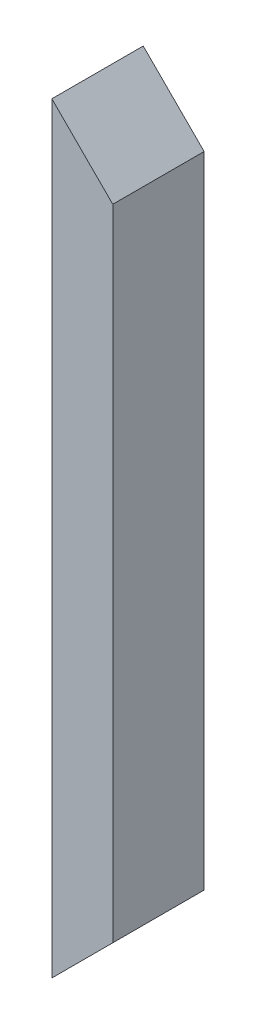
ISO-10303-21;
HEADER;
FILE_DESCRIPTION(('STEP AP214'),'2;1');
FILE_NAME('part.step','',(''),(''),'','','');
FILE_SCHEMA(('AUTOMOTIVE_DESIGN { 1 0 10303 214 1 1 1 1 }'));
ENDSEC;
DATA;
#1=APPLICATION_CONTEXT('core data for automotive mechanical design processes');
#2=APPLICATION_PROTOCOL_DEFINITION('international standard','automotive_design',2000,#1);
#3=PRODUCT_CONTEXT('',#1,'mechanical');
#4=PRODUCT('Part','Part','',(#3));
#5=PRODUCT_RELATED_PRODUCT_CATEGORY('part','',(#4));
#6=PRODUCT_DEFINITION_FORMATION('','',#4);
#7=PRODUCT_DEFINITION_CONTEXT('part definition',#1,'design');
#8=PRODUCT_DEFINITION('design','',#6,#7);
#9=PRODUCT_DEFINITION_SHAPE('','',#8);
#10=(LENGTH_UNIT() NAMED_UNIT(*) SI_UNIT(.MILLI.,.METRE.));
#11=(NAMED_UNIT(*) PLANE_ANGLE_UNIT() SI_UNIT($,.RADIAN.));
#12=(NAMED_UNIT(*) SI_UNIT($,.STERADIAN.) SOLID_ANGLE_UNIT());
#13=UNCERTAINTY_MEASURE_WITH_UNIT(LENGTH_MEASURE(1.E-05),#10,'distance_accuracy_value','');
#14=(GEOMETRIC_REPRESENTATION_CONTEXT(3) GLOBAL_UNCERTAINTY_ASSIGNED_CONTEXT((#13)) GLOBAL_UNIT_ASSIGNED_CONTEXT((#10,
#11,#12)) REPRESENTATION_CONTEXT('',''));
#15=CARTESIAN_POINT('',(0.,0.,0.));
#16=DIRECTION('',(0.,0.,1.));
#17=DIRECTION('',(1.,0.,0.));
#18=AXIS2_PLACEMENT_3D('',#15,#16,#17);
#19=CARTESIAN_POINT('',(-330.,-120.,30.));
#20=DIRECTION('',(-0.707106781186551,-0.707106781186544,0.));
#21=DIRECTION('',(0.707106781186544,-0.707106781186551,0.));
#22=AXIS2_PLACEMENT_3D('',#19,#20,#21);
#23=PLANE('',#22);
#24=DIRECTION('',(-0.707106781186544,0.707106781186551,0.));
#25=VECTOR('',#24,1.);
#26=CARTESIAN_POINT('',(-330.,-120.,0.));
#27=LINE('',#26,#25);
#28=CARTESIAN_POINT('',(-330.,-120.,0.));
#29=VERTEX_POINT('',#28);
#30=CARTESIAN_POINT('',(-350.,-99.9999999999999,0.));
#31=VERTEX_POINT('',#30);
#32=EDGE_CURVE('E107',#29,#31,#27,.T.);
#33=ORIENTED_EDGE('',*,*,#32,.T.);
#34=DIRECTION('',(0.,0.,-1.));
#35=VECTOR('',#34,1.);
#36=CARTESIAN_POINT('',(-350.,-99.9999999999999,30.));
#37=LINE('',#36,#35);
#38=CARTESIAN_POINT('',(-350.,-99.9999999999999,30.));
#39=VERTEX_POINT('',#38);
#40=EDGE_CURVE('E11',#39,#31,#37,.T.);
#41=ORIENTED_EDGE('',*,*,#40,.F.);
#42=DIRECTION('',(-0.707106781186544,0.707106781186551,0.));
#43=VECTOR('',#42,1.);
#44=CARTESIAN_POINT('',(-330.,-120.,30.));
#45=LINE('',#44,#43);
#46=CARTESIAN_POINT('',(-330.,-120.,30.));
#47=VERTEX_POINT('',#46);
#48=EDGE_CURVE('E91',#47,#39,#45,.T.);
#49=ORIENTED_EDGE('',*,*,#48,.F.);
#50=DIRECTION('',(0.,0.,-1.));
#51=VECTOR('',#50,1.);
#52=CARTESIAN_POINT('',(-330.,-120.,30.));
#53=LINE('',#52,#51);
#54=EDGE_CURVE('E103',#47,#29,#53,.T.);
#55=ORIENTED_EDGE('',*,*,#54,.T.);
#56=EDGE_LOOP('',(#33,#41,#49,#55));
#57=FACE_BOUND('',#56,.T.);
#58=ADVANCED_FACE('F39',(#57),#23,.F.);
#59=CARTESIAN_POINT('',(-350.,-99.9999999999999,30.));
#60=DIRECTION('',(1.,0.,0.));
#61=DIRECTION('',(0.,1.,0.));
#62=AXIS2_PLACEMENT_3D('',#59,#60,#61);
#63=PLANE('',#62);
#64=DIRECTION('',(0.,-1.,0.));
#65=VECTOR('',#64,1.);
#66=CARTESIAN_POINT('',(-350.,-99.9999999999999,0.));
#67=LINE('',#66,#65);
#68=CARTESIAN_POINT('',(-350.,-350.,0.));
#69=VERTEX_POINT('',#68);
#70=EDGE_CURVE('E96',#31,#69,#67,.T.);
#71=ORIENTED_EDGE('',*,*,#70,.T.);
#72=DIRECTION('',(0.,0.,-1.));
#73=VECTOR('',#72,1.);
#74=CARTESIAN_POINT('',(-350.,-350.,30.));
#75=LINE('',#74,#73);
#76=CARTESIAN_POINT('',(-350.,-350.,30.));
#77=VERTEX_POINT('',#76);
#78=EDGE_CURVE('E48',#77,#69,#75,.T.);
#79=ORIENTED_EDGE('',*,*,#78,.F.);
#80=DIRECTION('',(0.,-1.,0.));
#81=VECTOR('',#80,1.);
#82=CARTESIAN_POINT('',(-350.,-99.9999999999999,30.));
#83=LINE('',#82,#81);
#84=EDGE_CURVE('E86',#39,#77,#83,.T.);
#85=ORIENTED_EDGE('',*,*,#84,.F.);
#86=ORIENTED_EDGE('',*,*,#40,.T.);
#87=EDGE_LOOP('',(#71,#79,#85,#86));
#88=FACE_BOUND('',#87,.T.);
#89=ADVANCED_FACE('F95',(#88),#63,.F.);
#90=CARTESIAN_POINT('',(-350.,-350.,30.));
#91=DIRECTION('',(-0.707106781186551,0.707106781186544,0.));
#92=DIRECTION('',(-0.707106781186544,-0.707106781186551,0.));
#93=AXIS2_PLACEMENT_3D('',#90,#91,#92);
#94=PLANE('',#93);
#95=DIRECTION('',(0.707106781186543,0.707106781186551,0.));
#96=VECTOR('',#95,1.);
#97=CARTESIAN_POINT('',(-350.,-350.,0.));
#98=LINE('',#97,#96);
#99=CARTESIAN_POINT('',(-330.,-330.,0.));
#100=VERTEX_POINT('',#99);
#101=EDGE_CURVE('E73',#69,#100,#98,.T.);
#102=ORIENTED_EDGE('',*,*,#101,.T.);
#103=DIRECTION('',(0.,0.,-1.));
#104=VECTOR('',#103,1.);
#105=CARTESIAN_POINT('',(-330.,-330.,30.));
#106=LINE('',#105,#104);
#107=CARTESIAN_POINT('',(-330.,-330.,30.));
#108=VERTEX_POINT('',#107);
#109=EDGE_CURVE('E98',#108,#100,#106,.T.);
#110=ORIENTED_EDGE('',*,*,#109,.F.);
#111=DIRECTION('',(0.707106781186543,0.707106781186551,0.));
#112=VECTOR('',#111,1.);
#113=CARTESIAN_POINT('',(-350.,-350.,30.));
#114=LINE('',#113,#112);
#115=EDGE_CURVE('E89',#77,#108,#114,.T.);
#116=ORIENTED_EDGE('',*,*,#115,.F.);
#117=ORIENTED_EDGE('',*,*,#78,.T.);
#118=EDGE_LOOP('',(#102,#110,#116,#117));
#119=FACE_BOUND('',#118,.T.);
#120=ADVANCED_FACE('F99',(#119),#94,.F.);
#121=CARTESIAN_POINT('',(-330.,-330.,30.));
#122=DIRECTION('',(-1.,0.,0.));
#123=DIRECTION('',(0.,0.,1.));
#124=AXIS2_PLACEMENT_3D('',#121,#122,#123);
#125=PLANE('',#124);
#126=DIRECTION('',(0.,1.,0.));
#127=VECTOR('',#126,1.);
#128=CARTESIAN_POINT('',(-330.,-330.,0.));
#129=LINE('',#128,#127);
#130=EDGE_CURVE('E79',#100,#29,#129,.T.);
#131=ORIENTED_EDGE('',*,*,#130,.T.);
#132=ORIENTED_EDGE('',*,*,#54,.F.);
#133=DIRECTION('',(0.,1.,0.));
#134=VECTOR('',#133,1.);
#135=CARTESIAN_POINT('',(-330.,-330.,30.));
#136=LINE('',#135,#134);
#137=EDGE_CURVE('E56',#108,#47,#136,.T.);
#138=ORIENTED_EDGE('',*,*,#137,.F.);
#139=ORIENTED_EDGE('',*,*,#109,.T.);
#140=EDGE_LOOP('',(#131,#132,#138,#139));
#141=FACE_BOUND('',#140,.T.);
#142=ADVANCED_FACE('F120',(#141),#125,.F.);
#143=CARTESIAN_POINT('',(0.,0.,30.));
#144=DIRECTION('',(0.,0.,-1.));
#145=DIRECTION('',(-1.,0.,0.));
#146=AXIS2_PLACEMENT_3D('',#143,#144,#145);
#147=PLANE('',#146);
#148=ORIENTED_EDGE('',*,*,#48,.T.);
#149=ORIENTED_EDGE('',*,*,#84,.T.);
#150=ORIENTED_EDGE('',*,*,#115,.T.);
#151=ORIENTED_EDGE('',*,*,#137,.T.);
#152=EDGE_LOOP('',(#148,#149,#150,#151));
#153=FACE_BOUND('',#152,.T.);
#154=ADVANCED_FACE('F87',(#153),#147,.F.);
#155=CARTESIAN_POINT('',(0.,0.,0.));
#156=DIRECTION('',(0.,0.,-1.));
#157=DIRECTION('',(-1.,0.,0.));
#158=AXIS2_PLACEMENT_3D('',#155,#156,#157);
#159=PLANE('',#158);
#160=ORIENTED_EDGE('',*,*,#32,.F.);
#161=ORIENTED_EDGE('',*,*,#130,.F.);
#162=ORIENTED_EDGE('',*,*,#101,.F.);
#163=ORIENTED_EDGE('',*,*,#70,.F.);
#164=EDGE_LOOP('',(#160,#161,#162,#163));
#165=FACE_BOUND('',#164,.T.);
#166=ADVANCED_FACE('F123',(#165),#159,.T.);
#167=CLOSED_SHELL('',(#58,#89,#120,#142,#154,#166));
#168=MANIFOLD_SOLID_BREP('B2',#167);
#169=ADVANCED_BREP_SHAPE_REPRESENTATION('',(#18,#168),#14);
#170=SHAPE_DEFINITION_REPRESENTATION(#9,#169);
ENDSEC;
END-ISO-10303-21;
